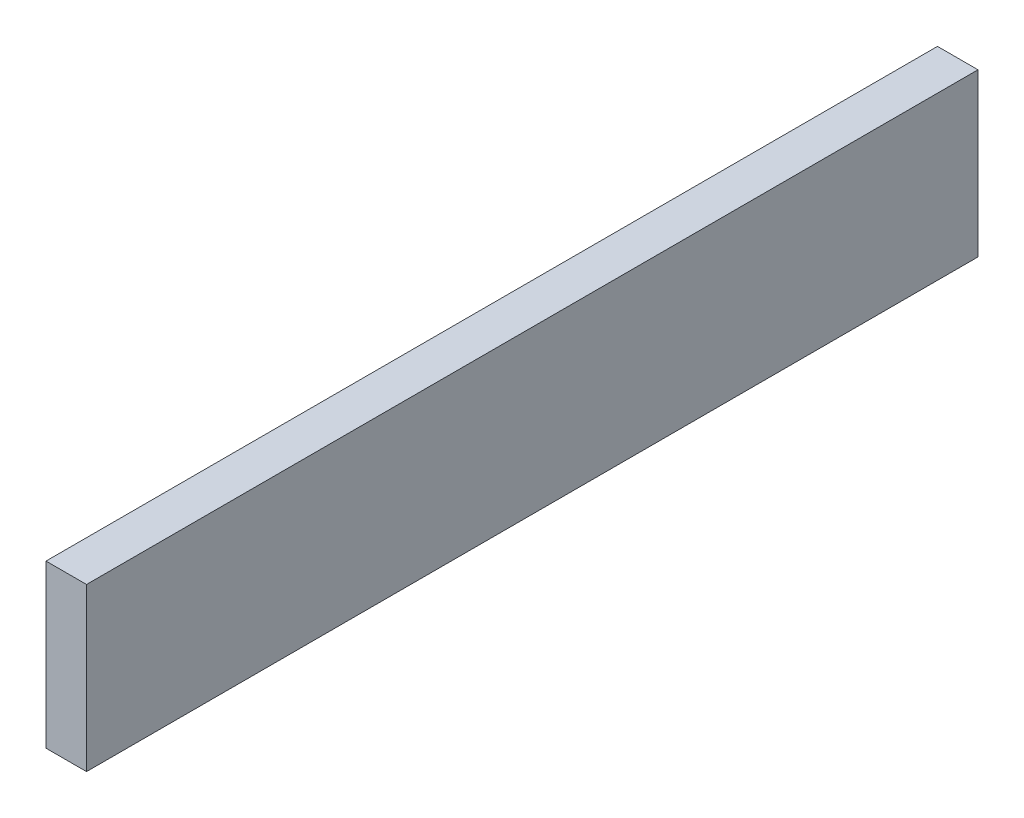
ISO-10303-21;
HEADER;
FILE_DESCRIPTION(('STEP AP214'),'2;1');
FILE_NAME('part.step','',(''),(''),'','','');
FILE_SCHEMA(('AUTOMOTIVE_DESIGN { 1 0 10303 214 1 1 1 1 }'));
ENDSEC;
DATA;
#1=APPLICATION_CONTEXT('core data for automotive mechanical design processes');
#2=APPLICATION_PROTOCOL_DEFINITION('international standard','automotive_design',2000,#1);
#3=PRODUCT_CONTEXT('',#1,'mechanical');
#4=PRODUCT('Part','Part','',(#3));
#5=PRODUCT_RELATED_PRODUCT_CATEGORY('part','',(#4));
#6=PRODUCT_DEFINITION_FORMATION('','',#4);
#7=PRODUCT_DEFINITION_CONTEXT('part definition',#1,'design');
#8=PRODUCT_DEFINITION('design','',#6,#7);
#9=PRODUCT_DEFINITION_SHAPE('','',#8);
#10=(LENGTH_UNIT() NAMED_UNIT(*) SI_UNIT(.MILLI.,.METRE.));
#11=(NAMED_UNIT(*) PLANE_ANGLE_UNIT() SI_UNIT($,.RADIAN.));
#12=(NAMED_UNIT(*) SI_UNIT($,.STERADIAN.) SOLID_ANGLE_UNIT());
#13=UNCERTAINTY_MEASURE_WITH_UNIT(LENGTH_MEASURE(1.E-05),#10,'distance_accuracy_value','');
#14=(GEOMETRIC_REPRESENTATION_CONTEXT(3) GLOBAL_UNCERTAINTY_ASSIGNED_CONTEXT((#13)) GLOBAL_UNIT_ASSIGNED_CONTEXT((#10,
#11,#12)) REPRESENTATION_CONTEXT('',''));
#15=CARTESIAN_POINT('',(0.,0.,0.));
#16=DIRECTION('',(0.,0.,1.));
#17=DIRECTION('',(1.,0.,0.));
#18=AXIS2_PLACEMENT_3D('',#15,#16,#17);
#19=CARTESIAN_POINT('',(0.,0.,139.7));
#20=DIRECTION('',(1.,0.,0.));
#21=DIRECTION('',(0.,0.,-1.));
#22=AXIS2_PLACEMENT_3D('',#19,#20,#21);
#23=PLANE('',#22);
#24=DIRECTION('',(0.,-1.,0.));
#25=VECTOR('',#24,1.);
#26=CARTESIAN_POINT('',(0.,0.,0.));
#27=LINE('',#26,#25);
#28=CARTESIAN_POINT('',(0.,25.4,0.));
#29=VERTEX_POINT('',#28);
#30=CARTESIAN_POINT('',(0.,0.,0.));
#31=VERTEX_POINT('',#30);
#32=EDGE_CURVE('E96',#29,#31,#27,.T.);
#33=ORIENTED_EDGE('',*,*,#32,.T.);
#34=DIRECTION('',(0.,0.,-1.));
#35=VECTOR('',#34,1.);
#36=CARTESIAN_POINT('',(0.,0.,139.7));
#37=LINE('',#36,#35);
#38=CARTESIAN_POINT('',(0.,0.,139.7));
#39=VERTEX_POINT('',#38);
#40=EDGE_CURVE('E11',#39,#31,#37,.T.);
#41=ORIENTED_EDGE('',*,*,#40,.F.);
#42=DIRECTION('',(0.,-1.,0.));
#43=VECTOR('',#42,1.);
#44=CARTESIAN_POINT('',(0.,0.,139.7));
#45=LINE('',#44,#43);
#46=CARTESIAN_POINT('',(0.,25.4,139.7));
#47=VERTEX_POINT('',#46);
#48=EDGE_CURVE('E84',#47,#39,#45,.T.);
#49=ORIENTED_EDGE('',*,*,#48,.F.);
#50=DIRECTION('',(0.,0.,-1.));
#51=VECTOR('',#50,1.);
#52=CARTESIAN_POINT('',(0.,25.4,139.7));
#53=LINE('',#52,#51);
#54=EDGE_CURVE('E92',#47,#29,#53,.T.);
#55=ORIENTED_EDGE('',*,*,#54,.T.);
#56=EDGE_LOOP('',(#33,#41,#49,#55));
#57=FACE_BOUND('',#56,.T.);
#58=ADVANCED_FACE('F33',(#57),#23,.F.);
#59=CARTESIAN_POINT('',(0.,0.,139.7));
#60=DIRECTION('',(0.,1.,0.));
#61=DIRECTION('',(0.,0.,1.));
#62=AXIS2_PLACEMENT_3D('',#59,#60,#61);
#63=PLANE('',#62);
#64=DIRECTION('',(1.,0.,0.));
#65=VECTOR('',#64,1.);
#66=CARTESIAN_POINT('',(0.,0.,0.));
#67=LINE('',#66,#65);
#68=CARTESIAN_POINT('',(6.35,0.,0.));
#69=VERTEX_POINT('',#68);
#70=EDGE_CURVE('E88',#31,#69,#67,.T.);
#71=ORIENTED_EDGE('',*,*,#70,.T.);
#72=DIRECTION('',(0.,0.,-1.));
#73=VECTOR('',#72,1.);
#74=CARTESIAN_POINT('',(6.35,0.,139.7));
#75=LINE('',#74,#73);
#76=CARTESIAN_POINT('',(6.35,0.,139.7));
#77=VERTEX_POINT('',#76);
#78=EDGE_CURVE('E41',#77,#69,#75,.T.);
#79=ORIENTED_EDGE('',*,*,#78,.F.);
#80=DIRECTION('',(1.,0.,0.));
#81=VECTOR('',#80,1.);
#82=CARTESIAN_POINT('',(0.,0.,139.7));
#83=LINE('',#82,#81);
#84=EDGE_CURVE('E79',#39,#77,#83,.T.);
#85=ORIENTED_EDGE('',*,*,#84,.F.);
#86=ORIENTED_EDGE('',*,*,#40,.T.);
#87=EDGE_LOOP('',(#71,#79,#85,#86));
#88=FACE_BOUND('',#87,.T.);
#89=ADVANCED_FACE('F87',(#88),#63,.F.);
#90=CARTESIAN_POINT('',(6.35,0.,139.7));
#91=DIRECTION('',(-1.,0.,0.));
#92=DIRECTION('',(0.,0.,1.));
#93=AXIS2_PLACEMENT_3D('',#90,#91,#92);
#94=PLANE('',#93);
#95=DIRECTION('',(0.,1.,0.));
#96=VECTOR('',#95,1.);
#97=CARTESIAN_POINT('',(6.35,0.,0.));
#98=LINE('',#97,#96);
#99=CARTESIAN_POINT('',(6.35,25.4,0.));
#100=VERTEX_POINT('',#99);
#101=EDGE_CURVE('E66',#69,#100,#98,.T.);
#102=ORIENTED_EDGE('',*,*,#101,.T.);
#103=DIRECTION('',(0.,0.,-1.));
#104=VECTOR('',#103,1.);
#105=CARTESIAN_POINT('',(6.35,25.4,139.7));
#106=LINE('',#105,#104);
#107=CARTESIAN_POINT('',(6.35,25.4,139.7));
#108=VERTEX_POINT('',#107);
#109=EDGE_CURVE('E89',#108,#100,#106,.T.);
#110=ORIENTED_EDGE('',*,*,#109,.F.);
#111=DIRECTION('',(0.,1.,0.));
#112=VECTOR('',#111,1.);
#113=CARTESIAN_POINT('',(6.35,0.,139.7));
#114=LINE('',#113,#112);
#115=EDGE_CURVE('E82',#77,#108,#114,.T.);
#116=ORIENTED_EDGE('',*,*,#115,.F.);
#117=ORIENTED_EDGE('',*,*,#78,.T.);
#118=EDGE_LOOP('',(#102,#110,#116,#117));
#119=FACE_BOUND('',#118,.T.);
#120=ADVANCED_FACE('F90',(#119),#94,.F.);
#121=CARTESIAN_POINT('',(0.,25.4,139.7));
#122=DIRECTION('',(0.,-1.,0.));
#123=DIRECTION('',(0.,0.,-1.));
#124=AXIS2_PLACEMENT_3D('',#121,#122,#123);
#125=PLANE('',#124);
#126=DIRECTION('',(-1.,0.,0.));
#127=VECTOR('',#126,1.);
#128=CARTESIAN_POINT('',(0.,25.4,0.));
#129=LINE('',#128,#127);
#130=EDGE_CURVE('E72',#100,#29,#129,.T.);
#131=ORIENTED_EDGE('',*,*,#130,.T.);
#132=ORIENTED_EDGE('',*,*,#54,.F.);
#133=DIRECTION('',(-1.,0.,0.));
#134=VECTOR('',#133,1.);
#135=CARTESIAN_POINT('',(0.,25.4,139.7));
#136=LINE('',#135,#134);
#137=EDGE_CURVE('E49',#108,#47,#136,.T.);
#138=ORIENTED_EDGE('',*,*,#137,.F.);
#139=ORIENTED_EDGE('',*,*,#109,.T.);
#140=EDGE_LOOP('',(#131,#132,#138,#139));
#141=FACE_BOUND('',#140,.T.);
#142=ADVANCED_FACE('F103',(#141),#125,.F.);
#143=CARTESIAN_POINT('',(0.,0.,139.7));
#144=DIRECTION('',(0.,0.,-1.));
#145=DIRECTION('',(-1.,0.,0.));
#146=AXIS2_PLACEMENT_3D('',#143,#144,#145);
#147=PLANE('',#146);
#148=ORIENTED_EDGE('',*,*,#48,.T.);
#149=ORIENTED_EDGE('',*,*,#84,.T.);
#150=ORIENTED_EDGE('',*,*,#115,.T.);
#151=ORIENTED_EDGE('',*,*,#137,.T.);
#152=EDGE_LOOP('',(#148,#149,#150,#151));
#153=FACE_BOUND('',#152,.T.);
#154=ADVANCED_FACE('F80',(#153),#147,.F.);
#155=CARTESIAN_POINT('',(0.,0.,0.));
#156=DIRECTION('',(0.,0.,-1.));
#157=DIRECTION('',(-1.,0.,0.));
#158=AXIS2_PLACEMENT_3D('',#155,#156,#157);
#159=PLANE('',#158);
#160=ORIENTED_EDGE('',*,*,#32,.F.);
#161=ORIENTED_EDGE('',*,*,#130,.F.);
#162=ORIENTED_EDGE('',*,*,#101,.F.);
#163=ORIENTED_EDGE('',*,*,#70,.F.);
#164=EDGE_LOOP('',(#160,#161,#162,#163));
#165=FACE_BOUND('',#164,.T.);
#166=ADVANCED_FACE('F106',(#165),#159,.T.);
#167=CLOSED_SHELL('',(#58,#89,#120,#142,#154,#166));
#168=MANIFOLD_SOLID_BREP('B2',#167);
#169=ADVANCED_BREP_SHAPE_REPRESENTATION('',(#18,#168),#14);
#170=SHAPE_DEFINITION_REPRESENTATION(#9,#169);
ENDSEC;
END-ISO-10303-21;
